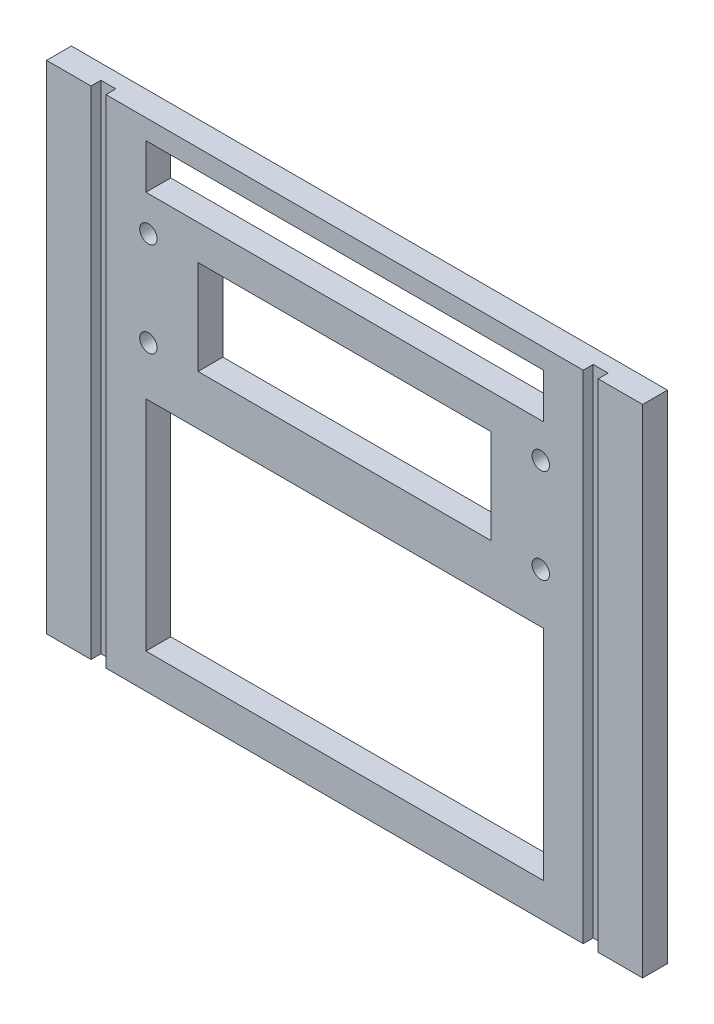
ISO-10303-21;
HEADER;
FILE_DESCRIPTION(('STEP AP214'),'2;1');
FILE_NAME('part.step','',(''),(''),'','','');
FILE_SCHEMA(('AUTOMOTIVE_DESIGN { 1 0 10303 214 1 1 1 1 }'));
ENDSEC;
DATA;
#1=APPLICATION_CONTEXT('core data for automotive mechanical design processes');
#2=APPLICATION_PROTOCOL_DEFINITION('international standard','automotive_design',2000,#1);
#3=PRODUCT_CONTEXT('',#1,'mechanical');
#4=PRODUCT('Part','Part','',(#3));
#5=PRODUCT_RELATED_PRODUCT_CATEGORY('part','',(#4));
#6=PRODUCT_DEFINITION_FORMATION('','',#4);
#7=PRODUCT_DEFINITION_CONTEXT('part definition',#1,'design');
#8=PRODUCT_DEFINITION('design','',#6,#7);
#9=PRODUCT_DEFINITION_SHAPE('','',#8);
#10=(LENGTH_UNIT() NAMED_UNIT(*) SI_UNIT(.MILLI.,.METRE.));
#11=(NAMED_UNIT(*) PLANE_ANGLE_UNIT() SI_UNIT($,.RADIAN.));
#12=(NAMED_UNIT(*) SI_UNIT($,.STERADIAN.) SOLID_ANGLE_UNIT());
#13=UNCERTAINTY_MEASURE_WITH_UNIT(LENGTH_MEASURE(1.E-05),#10,'distance_accuracy_value','');
#14=(GEOMETRIC_REPRESENTATION_CONTEXT(3) GLOBAL_UNCERTAINTY_ASSIGNED_CONTEXT((#13)) GLOBAL_UNIT_ASSIGNED_CONTEXT((#10,
#11,#12)) REPRESENTATION_CONTEXT('',''));
#15=CARTESIAN_POINT('',(0.,0.,0.));
#16=DIRECTION('',(0.,0.,1.));
#17=DIRECTION('',(1.,0.,0.));
#18=AXIS2_PLACEMENT_3D('',#15,#16,#17);
#19=CARTESIAN_POINT('',(0.,0.,5.));
#20=DIRECTION('',(0.,0.,-1.));
#21=DIRECTION('',(-1.,0.,0.));
#22=AXIS2_PLACEMENT_3D('',#19,#20,#21);
#23=PLANE('',#22);
#24=DIRECTION('',(1.,0.,0.));
#25=VECTOR('',#24,1.);
#26=CARTESIAN_POINT('',(0.,0.,5.));
#27=LINE('',#26,#25);
#28=CARTESIAN_POINT('',(0.,0.,5.));
#29=VERTEX_POINT('',#28);
#30=CARTESIAN_POINT('',(8.94999999999998,0.,5.));
#31=VERTEX_POINT('',#30);
#32=EDGE_CURVE('E381',#29,#31,#27,.T.);
#33=ORIENTED_EDGE('',*,*,#32,.T.);
#34=DIRECTION('',(0.,-1.,0.));
#35=VECTOR('',#34,1.);
#36=CARTESIAN_POINT('',(8.94999999999997,100.,5.));
#37=LINE('',#36,#35);
#38=CARTESIAN_POINT('',(8.94999999999997,100.,5.));
#39=VERTEX_POINT('',#38);
#40=EDGE_CURVE('E338',#39,#31,#37,.T.);
#41=ORIENTED_EDGE('',*,*,#40,.F.);
#42=DIRECTION('',(-1.,0.,0.));
#43=VECTOR('',#42,1.);
#44=CARTESIAN_POINT('',(0.,100.,5.));
#45=LINE('',#44,#43);
#46=CARTESIAN_POINT('',(0.,100.,5.));
#47=VERTEX_POINT('',#46);
#48=EDGE_CURVE('E387',#39,#47,#45,.T.);
#49=ORIENTED_EDGE('',*,*,#48,.T.);
#50=DIRECTION('',(0.,-1.,0.));
#51=VECTOR('',#50,1.);
#52=CARTESIAN_POINT('',(0.,0.,5.));
#53=LINE('',#52,#51);
#54=EDGE_CURVE('E376',#47,#29,#53,.T.);
#55=ORIENTED_EDGE('',*,*,#54,.T.);
#56=EDGE_LOOP('',(#33,#41,#49,#55));
#57=FACE_BOUND('',#56,.T.);
#58=ADVANCED_FACE('F37',(#57),#23,.F.);
#59=DIRECTION('',(1.,0.,0.));
#60=VECTOR('',#59,1.);
#61=CARTESIAN_POINT('',(20.,7.,5.));
#62=LINE('',#61,#60);
#63=CARTESIAN_POINT('',(20.,7.,5.));
#64=VERTEX_POINT('',#63);
#65=CARTESIAN_POINT('',(100.,7.,5.));
#66=VERTEX_POINT('',#65);
#67=EDGE_CURVE('E292',#64,#66,#62,.T.);
#68=ORIENTED_EDGE('',*,*,#67,.F.);
#69=DIRECTION('',(0.,-1.,0.));
#70=VECTOR('',#69,1.);
#71=CARTESIAN_POINT('',(20.,51.,5.));
#72=LINE('',#71,#70);
#73=CARTESIAN_POINT('',(20.,51.,5.));
#74=VERTEX_POINT('',#73);
#75=EDGE_CURVE('E52',#74,#64,#72,.T.);
#76=ORIENTED_EDGE('',*,*,#75,.F.);
#77=DIRECTION('',(-1.,0.,0.));
#78=VECTOR('',#77,1.);
#79=CARTESIAN_POINT('',(20.,51.,5.));
#80=LINE('',#79,#78);
#81=CARTESIAN_POINT('',(100.,51.,5.));
#82=VERTEX_POINT('',#81);
#83=EDGE_CURVE('E281',#82,#74,#80,.T.);
#84=ORIENTED_EDGE('',*,*,#83,.F.);
#85=DIRECTION('',(0.,1.,0.));
#86=VECTOR('',#85,1.);
#87=CARTESIAN_POINT('',(100.,51.,5.));
#88=LINE('',#87,#86);
#89=EDGE_CURVE('E295',#66,#82,#88,.T.);
#90=ORIENTED_EDGE('',*,*,#89,.F.);
#91=EDGE_LOOP('',(#68,#76,#84,#90));
#92=FACE_BOUND('',#91,.T.);
#93=CARTESIAN_POINT('',(99.5,61.,5.));
#94=DIRECTION('',(0.,0.,1.));
#95=DIRECTION('',(1.,0.,0.));
#96=AXIS2_PLACEMENT_3D('',#93,#94,#95);
#97=CIRCLE('',#96,1.75);
#98=CARTESIAN_POINT('',(101.25,61.,5.));
#99=VERTEX_POINT('',#98);
#100=EDGE_CURVE('E273',#99,#99,#97,.T.);
#101=ORIENTED_EDGE('',*,*,#100,.F.);
#102=EDGE_LOOP('',(#101));
#103=FACE_BOUND('',#102,.T.);
#104=CARTESIAN_POINT('',(99.5,80.,5.));
#105=DIRECTION('',(0.,0.,1.));
#106=DIRECTION('',(1.,0.,0.));
#107=AXIS2_PLACEMENT_3D('',#104,#105,#106);
#108=CIRCLE('',#107,1.75);
#109=CARTESIAN_POINT('',(101.25,80.,5.));
#110=VERTEX_POINT('',#109);
#111=EDGE_CURVE('E272',#110,#110,#108,.T.);
#112=ORIENTED_EDGE('',*,*,#111,.F.);
#113=EDGE_LOOP('',(#112));
#114=FACE_BOUND('',#113,.T.);
#115=CARTESIAN_POINT('',(20.5,61.,5.));
#116=DIRECTION('',(0.,0.,1.));
#117=DIRECTION('',(1.,0.,0.));
#118=AXIS2_PLACEMENT_3D('',#115,#116,#117);
#119=CIRCLE('',#118,1.75);
#120=CARTESIAN_POINT('',(22.25,61.,5.));
#121=VERTEX_POINT('',#120);
#122=EDGE_CURVE('E310',#121,#121,#119,.T.);
#123=ORIENTED_EDGE('',*,*,#122,.F.);
#124=EDGE_LOOP('',(#123));
#125=FACE_BOUND('',#124,.T.);
#126=DIRECTION('',(1.,0.,0.));
#127=VECTOR('',#126,1.);
#128=CARTESIAN_POINT('',(20.,87.,5.));
#129=LINE('',#128,#127);
#130=CARTESIAN_POINT('',(20.,87.,5.));
#131=VERTEX_POINT('',#130);
#132=CARTESIAN_POINT('',(100.,87.,5.));
#133=VERTEX_POINT('',#132);
#134=EDGE_CURVE('E228',#131,#133,#129,.T.);
#135=ORIENTED_EDGE('',*,*,#134,.F.);
#136=DIRECTION('',(0.,-1.,0.));
#137=VECTOR('',#136,1.);
#138=CARTESIAN_POINT('',(20.,87.,5.));
#139=LINE('',#138,#137);
#140=CARTESIAN_POINT('',(20.,96.,5.));
#141=VERTEX_POINT('',#140);
#142=EDGE_CURVE('E60',#141,#131,#139,.T.);
#143=ORIENTED_EDGE('',*,*,#142,.F.);
#144=DIRECTION('',(-1.,0.,0.));
#145=VECTOR('',#144,1.);
#146=CARTESIAN_POINT('',(20.,96.,5.));
#147=LINE('',#146,#145);
#148=CARTESIAN_POINT('',(100.,96.,5.));
#149=VERTEX_POINT('',#148);
#150=EDGE_CURVE('E219',#149,#141,#147,.T.);
#151=ORIENTED_EDGE('',*,*,#150,.F.);
#152=DIRECTION('',(0.,1.,0.));
#153=VECTOR('',#152,1.);
#154=CARTESIAN_POINT('',(100.,87.,5.));
#155=LINE('',#154,#153);
#156=EDGE_CURVE('E222',#133,#149,#155,.T.);
#157=ORIENTED_EDGE('',*,*,#156,.F.);
#158=EDGE_LOOP('',(#135,#143,#151,#157));
#159=FACE_BOUND('',#158,.T.);
#160=DIRECTION('',(1.,0.,0.));
#161=VECTOR('',#160,1.);
#162=CARTESIAN_POINT('',(30.5,61.,5.));
#163=LINE('',#162,#161);
#164=CARTESIAN_POINT('',(30.5,61.,5.));
#165=VERTEX_POINT('',#164);
#166=CARTESIAN_POINT('',(89.5,61.,5.));
#167=VERTEX_POINT('',#166);
#168=EDGE_CURVE('E254',#165,#167,#163,.T.);
#169=ORIENTED_EDGE('',*,*,#168,.F.);
#170=DIRECTION('',(0.,-1.,0.));
#171=VECTOR('',#170,1.);
#172=CARTESIAN_POINT('',(30.5,80.,5.));
#173=LINE('',#172,#171);
#174=CARTESIAN_POINT('',(30.5,80.,5.));
#175=VERTEX_POINT('',#174);
#176=EDGE_CURVE('E252',#175,#165,#173,.T.);
#177=ORIENTED_EDGE('',*,*,#176,.F.);
#178=DIRECTION('',(-1.,0.,0.));
#179=VECTOR('',#178,1.);
#180=CARTESIAN_POINT('',(30.5,80.,5.));
#181=LINE('',#180,#179);
#182=CARTESIAN_POINT('',(89.5,80.,5.));
#183=VERTEX_POINT('',#182);
#184=EDGE_CURVE('E242',#183,#175,#181,.T.);
#185=ORIENTED_EDGE('',*,*,#184,.F.);
#186=DIRECTION('',(0.,1.,0.));
#187=VECTOR('',#186,1.);
#188=CARTESIAN_POINT('',(89.5,80.,5.));
#189=LINE('',#188,#187);
#190=EDGE_CURVE('E257',#167,#183,#189,.T.);
#191=ORIENTED_EDGE('',*,*,#190,.F.);
#192=EDGE_LOOP('',(#169,#177,#185,#191));
#193=FACE_BOUND('',#192,.T.);
#194=CARTESIAN_POINT('',(20.5,80.,5.));
#195=DIRECTION('',(0.,0.,1.));
#196=DIRECTION('',(1.,0.,0.));
#197=AXIS2_PLACEMENT_3D('',#194,#195,#196);
#198=CIRCLE('',#197,1.75);
#199=CARTESIAN_POINT('',(22.25,80.,5.));
#200=VERTEX_POINT('',#199);
#201=EDGE_CURVE('E309',#200,#200,#198,.T.);
#202=ORIENTED_EDGE('',*,*,#201,.F.);
#203=EDGE_LOOP('',(#202));
#204=FACE_BOUND('',#203,.T.);
#205=CARTESIAN_POINT('',(108.05,100.,5.));
#206=VERTEX_POINT('',#205);
#207=CARTESIAN_POINT('',(11.95,100.,5.));
#208=VERTEX_POINT('',#207);
#209=EDGE_CURVE('E392',#206,#208,#45,.T.);
#210=ORIENTED_EDGE('',*,*,#209,.T.);
#211=DIRECTION('',(0.,1.,0.));
#212=VECTOR('',#211,1.);
#213=CARTESIAN_POINT('',(11.95,100.,5.));
#214=LINE('',#213,#212);
#215=CARTESIAN_POINT('',(11.95,0.,5.));
#216=VERTEX_POINT('',#215);
#217=EDGE_CURVE('E328',#216,#208,#214,.T.);
#218=ORIENTED_EDGE('',*,*,#217,.F.);
#219=CARTESIAN_POINT('',(108.05,0.,5.));
#220=VERTEX_POINT('',#219);
#221=EDGE_CURVE('E385',#216,#220,#27,.T.);
#222=ORIENTED_EDGE('',*,*,#221,.T.);
#223=DIRECTION('',(0.,-1.,0.));
#224=VECTOR('',#223,1.);
#225=CARTESIAN_POINT('',(108.05,0.,5.));
#226=LINE('',#225,#224);
#227=EDGE_CURVE('E321',#206,#220,#226,.T.);
#228=ORIENTED_EDGE('',*,*,#227,.F.);
#229=EDGE_LOOP('',(#210,#218,#222,#228));
#230=FACE_BOUND('',#229,.T.);
#231=ADVANCED_FACE('F432',(#92,#103,#114,#125,#159,#193,#204,#230),#23,.F.);
#232=CARTESIAN_POINT('',(0.,0.,5.));
#233=DIRECTION('',(1.,0.,0.));
#234=DIRECTION('',(0.,1.,0.));
#235=AXIS2_PLACEMENT_3D('',#232,#233,#234);
#236=PLANE('',#235);
#237=DIRECTION('',(0.,-1.,0.));
#238=VECTOR('',#237,1.);
#239=CARTESIAN_POINT('',(0.,0.,0.));
#240=LINE('',#239,#238);
#241=CARTESIAN_POINT('',(0.,100.,0.));
#242=VERTEX_POINT('',#241);
#243=CARTESIAN_POINT('',(0.,0.,0.));
#244=VERTEX_POINT('',#243);
#245=EDGE_CURVE('E344',#242,#244,#240,.T.);
#246=ORIENTED_EDGE('',*,*,#245,.T.);
#247=DIRECTION('',(0.,0.,-1.));
#248=VECTOR('',#247,1.);
#249=CARTESIAN_POINT('',(0.,0.,5.));
#250=LINE('',#249,#248);
#251=EDGE_CURVE('E11',#29,#244,#250,.T.);
#252=ORIENTED_EDGE('',*,*,#251,.F.);
#253=ORIENTED_EDGE('',*,*,#54,.F.);
#254=DIRECTION('',(0.,0.,-1.));
#255=VECTOR('',#254,1.);
#256=CARTESIAN_POINT('',(0.,100.,5.));
#257=LINE('',#256,#255);
#258=EDGE_CURVE('E391',#47,#242,#257,.T.);
#259=ORIENTED_EDGE('',*,*,#258,.T.);
#260=EDGE_LOOP('',(#246,#252,#253,#259));
#261=FACE_BOUND('',#260,.T.);
#262=ADVANCED_FACE('F39',(#261),#236,.F.);
#263=CARTESIAN_POINT('',(0.,0.,5.));
#264=DIRECTION('',(0.,1.,0.));
#265=DIRECTION('',(0.,0.,1.));
#266=AXIS2_PLACEMENT_3D('',#263,#264,#265);
#267=PLANE('',#266);
#268=DIRECTION('',(1.,0.,0.));
#269=VECTOR('',#268,1.);
#270=CARTESIAN_POINT('',(8.94999999999998,0.,3.));
#271=LINE('',#270,#269);
#272=CARTESIAN_POINT('',(8.94999999999998,0.,3.));
#273=VERTEX_POINT('',#272);
#274=CARTESIAN_POINT('',(11.95,0.,3.));
#275=VERTEX_POINT('',#274);
#276=EDGE_CURVE('E327',#273,#275,#271,.T.);
#277=ORIENTED_EDGE('',*,*,#276,.F.);
#278=DIRECTION('',(0.,0.,1.));
#279=VECTOR('',#278,1.);
#280=CARTESIAN_POINT('',(8.94999999999998,0.,3.));
#281=LINE('',#280,#279);
#282=EDGE_CURVE('E337',#273,#31,#281,.T.);
#283=ORIENTED_EDGE('',*,*,#282,.T.);
#284=ORIENTED_EDGE('',*,*,#32,.F.);
#285=ORIENTED_EDGE('',*,*,#251,.T.);
#286=DIRECTION('',(1.,0.,0.));
#287=VECTOR('',#286,1.);
#288=CARTESIAN_POINT('',(0.,0.,0.));
#289=LINE('',#288,#287);
#290=CARTESIAN_POINT('',(120.,0.,0.));
#291=VERTEX_POINT('',#290);
#292=EDGE_CURVE('E395',#244,#291,#289,.T.);
#293=ORIENTED_EDGE('',*,*,#292,.T.);
#294=DIRECTION('',(0.,0.,-1.));
#295=VECTOR('',#294,1.);
#296=CARTESIAN_POINT('',(120.,0.,5.));
#297=LINE('',#296,#295);
#298=CARTESIAN_POINT('',(120.,0.,5.));
#299=VERTEX_POINT('',#298);
#300=EDGE_CURVE('E45',#299,#291,#297,.T.);
#301=ORIENTED_EDGE('',*,*,#300,.F.);
#302=CARTESIAN_POINT('',(111.05,0.,5.));
#303=VERTEX_POINT('',#302);
#304=EDGE_CURVE('E379',#303,#299,#27,.T.);
#305=ORIENTED_EDGE('',*,*,#304,.F.);
#306=DIRECTION('',(0.,0.,1.));
#307=VECTOR('',#306,1.);
#308=CARTESIAN_POINT('',(111.05,0.,3.));
#309=LINE('',#308,#307);
#310=CARTESIAN_POINT('',(111.05,0.,3.));
#311=VERTEX_POINT('',#310);
#312=EDGE_CURVE('E372',#311,#303,#309,.T.);
#313=ORIENTED_EDGE('',*,*,#312,.F.);
#314=DIRECTION('',(1.,0.,0.));
#315=VECTOR('',#314,1.);
#316=CARTESIAN_POINT('',(108.05,0.,3.));
#317=LINE('',#316,#315);
#318=CARTESIAN_POINT('',(108.05,0.,3.));
#319=VERTEX_POINT('',#318);
#320=EDGE_CURVE('E355',#319,#311,#317,.T.);
#321=ORIENTED_EDGE('',*,*,#320,.F.);
#322=DIRECTION('',(0.,0.,1.));
#323=VECTOR('',#322,1.);
#324=CARTESIAN_POINT('',(108.05,0.,3.));
#325=LINE('',#324,#323);
#326=EDGE_CURVE('E365',#319,#220,#325,.T.);
#327=ORIENTED_EDGE('',*,*,#326,.T.);
#328=ORIENTED_EDGE('',*,*,#221,.F.);
#329=DIRECTION('',(0.,0.,1.));
#330=VECTOR('',#329,1.);
#331=CARTESIAN_POINT('',(11.95,0.,3.));
#332=LINE('',#331,#330);
#333=EDGE_CURVE('E348',#275,#216,#332,.T.);
#334=ORIENTED_EDGE('',*,*,#333,.F.);
#335=EDGE_LOOP('',(#277,#283,#284,#285,#293,#301,#305,#313,#321,#327,#328,#334));
#336=FACE_BOUND('',#335,.T.);
#337=ADVANCED_FACE('F444',(#336),#267,.F.);
#338=CARTESIAN_POINT('',(120.,0.,5.));
#339=DIRECTION('',(-1.,0.,0.));
#340=DIRECTION('',(0.,-1.,0.));
#341=AXIS2_PLACEMENT_3D('',#338,#339,#340);
#342=PLANE('',#341);
#343=DIRECTION('',(0.,1.,0.));
#344=VECTOR('',#343,1.);
#345=CARTESIAN_POINT('',(120.,0.,0.));
#346=LINE('',#345,#344);
#347=CARTESIAN_POINT('',(120.,100.,0.));
#348=VERTEX_POINT('',#347);
#349=EDGE_CURVE('E397',#291,#348,#346,.T.);
#350=ORIENTED_EDGE('',*,*,#349,.T.);
#351=DIRECTION('',(0.,0.,-1.));
#352=VECTOR('',#351,1.);
#353=CARTESIAN_POINT('',(120.,100.,5.));
#354=LINE('',#353,#352);
#355=CARTESIAN_POINT('',(120.,100.,5.));
#356=VERTEX_POINT('',#355);
#357=EDGE_CURVE('E402',#356,#348,#354,.T.);
#358=ORIENTED_EDGE('',*,*,#357,.F.);
#359=DIRECTION('',(0.,1.,0.));
#360=VECTOR('',#359,1.);
#361=CARTESIAN_POINT('',(120.,0.,5.));
#362=LINE('',#361,#360);
#363=EDGE_CURVE('E384',#299,#356,#362,.T.);
#364=ORIENTED_EDGE('',*,*,#363,.F.);
#365=ORIENTED_EDGE('',*,*,#300,.T.);
#366=EDGE_LOOP('',(#350,#358,#364,#365));
#367=FACE_BOUND('',#366,.T.);
#368=ADVANCED_FACE('F409',(#367),#342,.F.);
#369=CARTESIAN_POINT('',(0.,100.,5.));
#370=DIRECTION('',(0.,-1.,0.));
#371=DIRECTION('',(0.,0.,-1.));
#372=AXIS2_PLACEMENT_3D('',#369,#370,#371);
#373=PLANE('',#372);
#374=ORIENTED_EDGE('',*,*,#48,.F.);
#375=DIRECTION('',(0.,0.,1.));
#376=VECTOR('',#375,1.);
#377=CARTESIAN_POINT('',(8.94999999999997,100.,3.));
#378=LINE('',#377,#376);
#379=CARTESIAN_POINT('',(8.94999999999997,100.,3.));
#380=VERTEX_POINT('',#379);
#381=EDGE_CURVE('E342',#380,#39,#378,.T.);
#382=ORIENTED_EDGE('',*,*,#381,.F.);
#383=DIRECTION('',(-1.,0.,0.));
#384=VECTOR('',#383,1.);
#385=CARTESIAN_POINT('',(8.94999999999997,100.,3.));
#386=LINE('',#385,#384);
#387=CARTESIAN_POINT('',(11.95,100.,3.));
#388=VERTEX_POINT('',#387);
#389=EDGE_CURVE('E334',#388,#380,#386,.T.);
#390=ORIENTED_EDGE('',*,*,#389,.F.);
#391=DIRECTION('',(0.,0.,1.));
#392=VECTOR('',#391,1.);
#393=CARTESIAN_POINT('',(11.95,100.,3.));
#394=LINE('',#393,#392);
#395=EDGE_CURVE('E345',#388,#208,#394,.T.);
#396=ORIENTED_EDGE('',*,*,#395,.T.);
#397=ORIENTED_EDGE('',*,*,#209,.F.);
#398=DIRECTION('',(0.,0.,1.));
#399=VECTOR('',#398,1.);
#400=CARTESIAN_POINT('',(108.05,100.,3.));
#401=LINE('',#400,#399);
#402=CARTESIAN_POINT('',(108.05,100.,3.));
#403=VERTEX_POINT('',#402);
#404=EDGE_CURVE('E340',#403,#206,#401,.T.);
#405=ORIENTED_EDGE('',*,*,#404,.F.);
#406=DIRECTION('',(-1.,0.,0.));
#407=VECTOR('',#406,1.);
#408=CARTESIAN_POINT('',(108.05,100.,3.));
#409=LINE('',#408,#407);
#410=CARTESIAN_POINT('',(111.05,100.,3.));
#411=VERTEX_POINT('',#410);
#412=EDGE_CURVE('E362',#411,#403,#409,.T.);
#413=ORIENTED_EDGE('',*,*,#412,.F.);
#414=DIRECTION('',(0.,0.,1.));
#415=VECTOR('',#414,1.);
#416=CARTESIAN_POINT('',(111.05,100.,3.));
#417=LINE('',#416,#415);
#418=CARTESIAN_POINT('',(111.05,100.,5.));
#419=VERTEX_POINT('',#418);
#420=EDGE_CURVE('E369',#411,#419,#417,.T.);
#421=ORIENTED_EDGE('',*,*,#420,.T.);
#422=EDGE_CURVE('E388',#356,#419,#45,.T.);
#423=ORIENTED_EDGE('',*,*,#422,.F.);
#424=ORIENTED_EDGE('',*,*,#357,.T.);
#425=DIRECTION('',(-1.,0.,0.));
#426=VECTOR('',#425,1.);
#427=CARTESIAN_POINT('',(0.,100.,0.));
#428=LINE('',#427,#426);
#429=EDGE_CURVE('E380',#348,#242,#428,.T.);
#430=ORIENTED_EDGE('',*,*,#429,.T.);
#431=ORIENTED_EDGE('',*,*,#258,.F.);
#432=EDGE_LOOP('',(#374,#382,#390,#396,#397,#405,#413,#421,#423,#424,#430,#431));
#433=FACE_BOUND('',#432,.T.);
#434=ADVANCED_FACE('F419',(#433),#373,.F.);
#435=ORIENTED_EDGE('',*,*,#422,.T.);
#436=DIRECTION('',(0.,1.,0.));
#437=VECTOR('',#436,1.);
#438=CARTESIAN_POINT('',(111.05,0.,5.));
#439=LINE('',#438,#437);
#440=EDGE_CURVE('E356',#303,#419,#439,.T.);
#441=ORIENTED_EDGE('',*,*,#440,.F.);
#442=ORIENTED_EDGE('',*,*,#304,.T.);
#443=ORIENTED_EDGE('',*,*,#363,.T.);
#444=EDGE_LOOP('',(#435,#441,#442,#443));
#445=FACE_BOUND('',#444,.T.);
#446=ADVANCED_FACE('F448',(#445),#23,.F.);
#447=CARTESIAN_POINT('',(0.,0.,0.));
#448=DIRECTION('',(0.,0.,-1.));
#449=DIRECTION('',(-1.,0.,0.));
#450=AXIS2_PLACEMENT_3D('',#447,#448,#449);
#451=PLANE('',#450);
#452=DIRECTION('',(0.,-1.,0.));
#453=VECTOR('',#452,1.);
#454=CARTESIAN_POINT('',(20.,51.,0.));
#455=LINE('',#454,#453);
#456=CARTESIAN_POINT('',(20.,51.,0.));
#457=VERTEX_POINT('',#456);
#458=CARTESIAN_POINT('',(20.,7.,0.));
#459=VERTEX_POINT('',#458);
#460=EDGE_CURVE('E277',#457,#459,#455,.T.);
#461=ORIENTED_EDGE('',*,*,#460,.T.);
#462=DIRECTION('',(1.,0.,0.));
#463=VECTOR('',#462,1.);
#464=CARTESIAN_POINT('',(20.,7.,0.));
#465=LINE('',#464,#463);
#466=CARTESIAN_POINT('',(100.,7.,0.));
#467=VERTEX_POINT('',#466);
#468=EDGE_CURVE('E280',#459,#467,#465,.T.);
#469=ORIENTED_EDGE('',*,*,#468,.T.);
#470=DIRECTION('',(0.,1.,0.));
#471=VECTOR('',#470,1.);
#472=CARTESIAN_POINT('',(100.,51.,0.));
#473=LINE('',#472,#471);
#474=CARTESIAN_POINT('',(100.,51.,0.));
#475=VERTEX_POINT('',#474);
#476=EDGE_CURVE('E284',#467,#475,#473,.T.);
#477=ORIENTED_EDGE('',*,*,#476,.T.);
#478=DIRECTION('',(-1.,0.,0.));
#479=VECTOR('',#478,1.);
#480=CARTESIAN_POINT('',(20.,51.,0.));
#481=LINE('',#480,#479);
#482=EDGE_CURVE('E287',#475,#457,#481,.T.);
#483=ORIENTED_EDGE('',*,*,#482,.T.);
#484=EDGE_LOOP('',(#461,#469,#477,#483));
#485=FACE_BOUND('',#484,.T.);
#486=CARTESIAN_POINT('',(99.5,61.,0.));
#487=DIRECTION('',(0.,0.,1.));
#488=DIRECTION('',(1.,0.,0.));
#489=AXIS2_PLACEMENT_3D('',#486,#487,#488);
#490=CIRCLE('',#489,1.75);
#491=CARTESIAN_POINT('',(101.25,61.,0.));
#492=VERTEX_POINT('',#491);
#493=EDGE_CURVE('E269',#492,#492,#490,.T.);
#494=ORIENTED_EDGE('',*,*,#493,.T.);
#495=EDGE_LOOP('',(#494));
#496=FACE_BOUND('',#495,.T.);
#497=CARTESIAN_POINT('',(99.5,80.,0.));
#498=DIRECTION('',(0.,0.,1.));
#499=DIRECTION('',(1.,0.,0.));
#500=AXIS2_PLACEMENT_3D('',#497,#498,#499);
#501=CIRCLE('',#500,1.75);
#502=CARTESIAN_POINT('',(101.25,80.,0.));
#503=VERTEX_POINT('',#502);
#504=EDGE_CURVE('E313',#503,#503,#501,.T.);
#505=ORIENTED_EDGE('',*,*,#504,.T.);
#506=EDGE_LOOP('',(#505));
#507=FACE_BOUND('',#506,.T.);
#508=CARTESIAN_POINT('',(20.5,61.,0.));
#509=DIRECTION('',(0.,0.,1.));
#510=DIRECTION('',(1.,0.,0.));
#511=AXIS2_PLACEMENT_3D('',#508,#509,#510);
#512=CIRCLE('',#511,1.75);
#513=CARTESIAN_POINT('',(22.25,61.,0.));
#514=VERTEX_POINT('',#513);
#515=EDGE_CURVE('E306',#514,#514,#512,.T.);
#516=ORIENTED_EDGE('',*,*,#515,.T.);
#517=EDGE_LOOP('',(#516));
#518=FACE_BOUND('',#517,.T.);
#519=DIRECTION('',(0.,-1.,0.));
#520=VECTOR('',#519,1.);
#521=CARTESIAN_POINT('',(20.,87.,0.));
#522=LINE('',#521,#520);
#523=CARTESIAN_POINT('',(20.,96.,0.));
#524=VERTEX_POINT('',#523);
#525=CARTESIAN_POINT('',(20.,87.,0.));
#526=VERTEX_POINT('',#525);
#527=EDGE_CURVE('E200',#524,#526,#522,.T.);
#528=ORIENTED_EDGE('',*,*,#527,.T.);
#529=DIRECTION('',(1.,0.,0.));
#530=VECTOR('',#529,1.);
#531=CARTESIAN_POINT('',(20.,87.,0.));
#532=LINE('',#531,#530);
#533=CARTESIAN_POINT('',(100.,87.,0.));
#534=VERTEX_POINT('',#533);
#535=EDGE_CURVE('E210',#526,#534,#532,.T.);
#536=ORIENTED_EDGE('',*,*,#535,.T.);
#537=DIRECTION('',(0.,1.,0.));
#538=VECTOR('',#537,1.);
#539=CARTESIAN_POINT('',(100.,87.,0.));
#540=LINE('',#539,#538);
#541=CARTESIAN_POINT('',(100.,96.,0.));
#542=VERTEX_POINT('',#541);
#543=EDGE_CURVE('E214',#534,#542,#540,.T.);
#544=ORIENTED_EDGE('',*,*,#543,.T.);
#545=DIRECTION('',(-1.,0.,0.));
#546=VECTOR('',#545,1.);
#547=CARTESIAN_POINT('',(20.,96.,0.));
#548=LINE('',#547,#546);
#549=EDGE_CURVE('E206',#542,#524,#548,.T.);
#550=ORIENTED_EDGE('',*,*,#549,.T.);
#551=EDGE_LOOP('',(#528,#536,#544,#550));
#552=FACE_BOUND('',#551,.T.);
#553=DIRECTION('',(0.,-1.,0.));
#554=VECTOR('',#553,1.);
#555=CARTESIAN_POINT('',(30.5,80.,0.));
#556=LINE('',#555,#554);
#557=CARTESIAN_POINT('',(30.5,80.,0.));
#558=VERTEX_POINT('',#557);
#559=CARTESIAN_POINT('',(30.5,61.,0.));
#560=VERTEX_POINT('',#559);
#561=EDGE_CURVE('E238',#558,#560,#556,.T.);
#562=ORIENTED_EDGE('',*,*,#561,.T.);
#563=DIRECTION('',(1.,0.,0.));
#564=VECTOR('',#563,1.);
#565=CARTESIAN_POINT('',(30.5,61.,0.));
#566=LINE('',#565,#564);
#567=CARTESIAN_POINT('',(89.5,61.,0.));
#568=VERTEX_POINT('',#567);
#569=EDGE_CURVE('E241',#560,#568,#566,.T.);
#570=ORIENTED_EDGE('',*,*,#569,.T.);
#571=DIRECTION('',(0.,1.,0.));
#572=VECTOR('',#571,1.);
#573=CARTESIAN_POINT('',(89.5,80.,0.));
#574=LINE('',#573,#572);
#575=CARTESIAN_POINT('',(89.5,80.,0.));
#576=VERTEX_POINT('',#575);
#577=EDGE_CURVE('E245',#568,#576,#574,.T.);
#578=ORIENTED_EDGE('',*,*,#577,.T.);
#579=DIRECTION('',(-1.,0.,0.));
#580=VECTOR('',#579,1.);
#581=CARTESIAN_POINT('',(30.5,80.,0.));
#582=LINE('',#581,#580);
#583=EDGE_CURVE('E248',#576,#558,#582,.T.);
#584=ORIENTED_EDGE('',*,*,#583,.T.);
#585=EDGE_LOOP('',(#562,#570,#578,#584));
#586=FACE_BOUND('',#585,.T.);
#587=CARTESIAN_POINT('',(20.5,80.,0.));
#588=DIRECTION('',(0.,0.,1.));
#589=DIRECTION('',(1.,0.,0.));
#590=AXIS2_PLACEMENT_3D('',#587,#588,#589);
#591=CIRCLE('',#590,1.75);
#592=CARTESIAN_POINT('',(22.25,80.,0.));
#593=VERTEX_POINT('',#592);
#594=EDGE_CURVE('E318',#593,#593,#591,.T.);
#595=ORIENTED_EDGE('',*,*,#594,.T.);
#596=EDGE_LOOP('',(#595));
#597=FACE_BOUND('',#596,.T.);
#598=ORIENTED_EDGE('',*,*,#245,.F.);
#599=ORIENTED_EDGE('',*,*,#429,.F.);
#600=ORIENTED_EDGE('',*,*,#349,.F.);
#601=ORIENTED_EDGE('',*,*,#292,.F.);
#602=EDGE_LOOP('',(#598,#599,#600,#601));
#603=FACE_BOUND('',#602,.T.);
#604=ADVANCED_FACE('F216',(#485,#496,#507,#518,#552,#586,#597,#603),#451,.T.);
#605=CARTESIAN_POINT('',(108.05,0.,3.));
#606=DIRECTION('',(-1.,0.,0.));
#607=DIRECTION('',(0.,0.,1.));
#608=AXIS2_PLACEMENT_3D('',#605,#606,#607);
#609=PLANE('',#608);
#610=ORIENTED_EDGE('',*,*,#227,.T.);
#611=ORIENTED_EDGE('',*,*,#326,.F.);
#612=DIRECTION('',(0.,-1.,0.));
#613=VECTOR('',#612,1.);
#614=CARTESIAN_POINT('',(108.05,0.,3.));
#615=LINE('',#614,#613);
#616=EDGE_CURVE('E352',#403,#319,#615,.T.);
#617=ORIENTED_EDGE('',*,*,#616,.F.);
#618=ORIENTED_EDGE('',*,*,#404,.T.);
#619=EDGE_LOOP('',(#610,#611,#617,#618));
#620=FACE_BOUND('',#619,.T.);
#621=ADVANCED_FACE('F455',(#620),#609,.F.);
#622=CARTESIAN_POINT('',(111.05,0.,3.));
#623=DIRECTION('',(1.,0.,0.));
#624=DIRECTION('',(0.,0.,-1.));
#625=AXIS2_PLACEMENT_3D('',#622,#623,#624);
#626=PLANE('',#625);
#627=ORIENTED_EDGE('',*,*,#440,.T.);
#628=ORIENTED_EDGE('',*,*,#420,.F.);
#629=DIRECTION('',(0.,1.,0.));
#630=VECTOR('',#629,1.);
#631=CARTESIAN_POINT('',(111.05,0.,3.));
#632=LINE('',#631,#630);
#633=EDGE_CURVE('E359',#311,#411,#632,.T.);
#634=ORIENTED_EDGE('',*,*,#633,.F.);
#635=ORIENTED_EDGE('',*,*,#312,.T.);
#636=EDGE_LOOP('',(#627,#628,#634,#635));
#637=FACE_BOUND('',#636,.T.);
#638=ADVANCED_FACE('F451',(#637),#626,.F.);
#639=CARTESIAN_POINT('',(0.,0.,3.));
#640=DIRECTION('',(0.,0.,-1.));
#641=DIRECTION('',(-1.,0.,0.));
#642=AXIS2_PLACEMENT_3D('',#639,#640,#641);
#643=PLANE('',#642);
#644=ORIENTED_EDGE('',*,*,#616,.T.);
#645=ORIENTED_EDGE('',*,*,#320,.T.);
#646=ORIENTED_EDGE('',*,*,#633,.T.);
#647=ORIENTED_EDGE('',*,*,#412,.T.);
#648=EDGE_LOOP('',(#644,#645,#646,#647));
#649=FACE_BOUND('',#648,.T.);
#650=ADVANCED_FACE('F453',(#649),#643,.F.);
#651=CARTESIAN_POINT('',(8.94999999999997,100.,3.));
#652=DIRECTION('',(-1.,0.,0.));
#653=DIRECTION('',(0.,-1.,0.));
#654=AXIS2_PLACEMENT_3D('',#651,#652,#653);
#655=PLANE('',#654);
#656=ORIENTED_EDGE('',*,*,#40,.T.);
#657=ORIENTED_EDGE('',*,*,#282,.F.);
#658=DIRECTION('',(0.,-1.,0.));
#659=VECTOR('',#658,1.);
#660=CARTESIAN_POINT('',(8.94999999999997,100.,3.));
#661=LINE('',#660,#659);
#662=EDGE_CURVE('E324',#380,#273,#661,.T.);
#663=ORIENTED_EDGE('',*,*,#662,.F.);
#664=ORIENTED_EDGE('',*,*,#381,.T.);
#665=EDGE_LOOP('',(#656,#657,#663,#664));
#666=FACE_BOUND('',#665,.T.);
#667=ADVANCED_FACE('F667',(#666),#655,.F.);
#668=CARTESIAN_POINT('',(11.95,100.,3.));
#669=DIRECTION('',(1.,0.,0.));
#670=DIRECTION('',(0.,1.,0.));
#671=AXIS2_PLACEMENT_3D('',#668,#669,#670);
#672=PLANE('',#671);
#673=ORIENTED_EDGE('',*,*,#217,.T.);
#674=ORIENTED_EDGE('',*,*,#395,.F.);
#675=DIRECTION('',(0.,1.,0.));
#676=VECTOR('',#675,1.);
#677=CARTESIAN_POINT('',(11.95,100.,3.));
#678=LINE('',#677,#676);
#679=EDGE_CURVE('E331',#275,#388,#678,.T.);
#680=ORIENTED_EDGE('',*,*,#679,.F.);
#681=ORIENTED_EDGE('',*,*,#333,.T.);
#682=EDGE_LOOP('',(#673,#674,#680,#681));
#683=FACE_BOUND('',#682,.T.);
#684=ADVANCED_FACE('F439',(#683),#672,.F.);
#685=CARTESIAN_POINT('',(0.,0.,3.));
#686=DIRECTION('',(0.,0.,1.));
#687=DIRECTION('',(1.,0.,0.));
#688=AXIS2_PLACEMENT_3D('',#685,#686,#687);
#689=PLANE('',#688);
#690=ORIENTED_EDGE('',*,*,#662,.T.);
#691=ORIENTED_EDGE('',*,*,#276,.T.);
#692=ORIENTED_EDGE('',*,*,#679,.T.);
#693=ORIENTED_EDGE('',*,*,#389,.T.);
#694=EDGE_LOOP('',(#690,#691,#692,#693));
#695=FACE_BOUND('',#694,.T.);
#696=ADVANCED_FACE('F441',(#695),#689,.T.);
#697=CARTESIAN_POINT('',(20.5,80.,0.));
#698=DIRECTION('',(0.,0.,1.));
#699=DIRECTION('',(1.,0.,0.));
#700=AXIS2_PLACEMENT_3D('',#697,#698,#699);
#701=CYLINDRICAL_SURFACE('',#700,1.75);
#702=ORIENTED_EDGE('',*,*,#594,.F.);
#703=EDGE_LOOP('',(#702));
#704=FACE_BOUND('',#703,.T.);
#705=ORIENTED_EDGE('',*,*,#201,.T.);
#706=EDGE_LOOP('',(#705));
#707=FACE_BOUND('',#706,.T.);
#708=ADVANCED_FACE('F509',(#704,#707),#701,.F.);
#709=CARTESIAN_POINT('',(30.5,80.,0.));
#710=DIRECTION('',(-1.,0.,0.));
#711=DIRECTION('',(0.,-1.,0.));
#712=AXIS2_PLACEMENT_3D('',#709,#710,#711);
#713=PLANE('',#712);
#714=ORIENTED_EDGE('',*,*,#176,.T.);
#715=DIRECTION('',(0.,0.,1.));
#716=VECTOR('',#715,1.);
#717=CARTESIAN_POINT('',(30.5,61.,0.));
#718=LINE('',#717,#716);
#719=EDGE_CURVE('E251',#560,#165,#718,.T.);
#720=ORIENTED_EDGE('',*,*,#719,.F.);
#721=ORIENTED_EDGE('',*,*,#561,.F.);
#722=DIRECTION('',(0.,0.,1.));
#723=VECTOR('',#722,1.);
#724=CARTESIAN_POINT('',(30.5,80.,0.));
#725=LINE('',#724,#723);
#726=EDGE_CURVE('E229',#558,#175,#725,.T.);
#727=ORIENTED_EDGE('',*,*,#726,.T.);
#728=EDGE_LOOP('',(#714,#720,#721,#727));
#729=FACE_BOUND('',#728,.T.);
#730=ADVANCED_FACE('F514',(#729),#713,.F.);
#731=CARTESIAN_POINT('',(30.5,80.,0.));
#732=DIRECTION('',(0.,1.,0.));
#733=DIRECTION('',(0.,0.,1.));
#734=AXIS2_PLACEMENT_3D('',#731,#732,#733);
#735=PLANE('',#734);
#736=ORIENTED_EDGE('',*,*,#184,.T.);
#737=ORIENTED_EDGE('',*,*,#726,.F.);
#738=ORIENTED_EDGE('',*,*,#583,.F.);
#739=DIRECTION('',(0.,0.,1.));
#740=VECTOR('',#739,1.);
#741=CARTESIAN_POINT('',(89.5,80.,0.));
#742=LINE('',#741,#740);
#743=EDGE_CURVE('E263',#576,#183,#742,.T.);
#744=ORIENTED_EDGE('',*,*,#743,.T.);
#745=EDGE_LOOP('',(#736,#737,#738,#744));
#746=FACE_BOUND('',#745,.T.);
#747=ADVANCED_FACE('F524',(#746),#735,.F.);
#748=CARTESIAN_POINT('',(89.5,80.,0.));
#749=DIRECTION('',(1.,0.,0.));
#750=DIRECTION('',(0.,0.,-1.));
#751=AXIS2_PLACEMENT_3D('',#748,#749,#750);
#752=PLANE('',#751);
#753=ORIENTED_EDGE('',*,*,#190,.T.);
#754=ORIENTED_EDGE('',*,*,#743,.F.);
#755=ORIENTED_EDGE('',*,*,#577,.F.);
#756=DIRECTION('',(0.,0.,1.));
#757=VECTOR('',#756,1.);
#758=CARTESIAN_POINT('',(89.5,61.,0.));
#759=LINE('',#758,#757);
#760=EDGE_CURVE('E265',#568,#167,#759,.T.);
#761=ORIENTED_EDGE('',*,*,#760,.T.);
#762=EDGE_LOOP('',(#753,#754,#755,#761));
#763=FACE_BOUND('',#762,.T.);
#764=ADVANCED_FACE('F534',(#763),#752,.F.);
#765=CARTESIAN_POINT('',(30.5,61.,0.));
#766=DIRECTION('',(0.,-1.,0.));
#767=DIRECTION('',(0.,0.,-1.));
#768=AXIS2_PLACEMENT_3D('',#765,#766,#767);
#769=PLANE('',#768);
#770=ORIENTED_EDGE('',*,*,#168,.T.);
#771=ORIENTED_EDGE('',*,*,#760,.F.);
#772=ORIENTED_EDGE('',*,*,#569,.F.);
#773=ORIENTED_EDGE('',*,*,#719,.T.);
#774=EDGE_LOOP('',(#770,#771,#772,#773));
#775=FACE_BOUND('',#774,.T.);
#776=ADVANCED_FACE('F544',(#775),#769,.F.);
#777=CARTESIAN_POINT('',(20.,87.,0.));
#778=DIRECTION('',(-1.,0.,0.));
#779=DIRECTION('',(0.,0.,1.));
#780=AXIS2_PLACEMENT_3D('',#777,#778,#779);
#781=PLANE('',#780);
#782=ORIENTED_EDGE('',*,*,#142,.T.);
#783=DIRECTION('',(0.,0.,1.));
#784=VECTOR('',#783,1.);
#785=CARTESIAN_POINT('',(20.,87.,0.));
#786=LINE('',#785,#784);
#787=EDGE_CURVE('E196',#526,#131,#786,.T.);
#788=ORIENTED_EDGE('',*,*,#787,.F.);
#789=ORIENTED_EDGE('',*,*,#527,.F.);
#790=DIRECTION('',(0.,0.,1.));
#791=VECTOR('',#790,1.);
#792=CARTESIAN_POINT('',(20.,96.,0.));
#793=LINE('',#792,#791);
#794=EDGE_CURVE('E233',#524,#141,#793,.T.);
#795=ORIENTED_EDGE('',*,*,#794,.T.);
#796=EDGE_LOOP('',(#782,#788,#789,#795));
#797=FACE_BOUND('',#796,.T.);
#798=ADVANCED_FACE('F198',(#797),#781,.F.);
#799=CARTESIAN_POINT('',(20.,96.,0.));
#800=DIRECTION('',(0.,1.,0.));
#801=DIRECTION('',(0.,0.,1.));
#802=AXIS2_PLACEMENT_3D('',#799,#800,#801);
#803=PLANE('',#802);
#804=ORIENTED_EDGE('',*,*,#150,.T.);
#805=ORIENTED_EDGE('',*,*,#794,.F.);
#806=ORIENTED_EDGE('',*,*,#549,.F.);
#807=DIRECTION('',(0.,0.,1.));
#808=VECTOR('',#807,1.);
#809=CARTESIAN_POINT('',(100.,96.,0.));
#810=LINE('',#809,#808);
#811=EDGE_CURVE('E235',#542,#149,#810,.T.);
#812=ORIENTED_EDGE('',*,*,#811,.T.);
#813=EDGE_LOOP('',(#804,#805,#806,#812));
#814=FACE_BOUND('',#813,.T.);
#815=ADVANCED_FACE('F563',(#814),#803,.F.);
#816=CARTESIAN_POINT('',(100.,87.,0.));
#817=DIRECTION('',(1.,0.,0.));
#818=DIRECTION('',(0.,0.,-1.));
#819=AXIS2_PLACEMENT_3D('',#816,#817,#818);
#820=PLANE('',#819);
#821=ORIENTED_EDGE('',*,*,#156,.T.);
#822=ORIENTED_EDGE('',*,*,#811,.F.);
#823=ORIENTED_EDGE('',*,*,#543,.F.);
#824=DIRECTION('',(0.,0.,1.));
#825=VECTOR('',#824,1.);
#826=CARTESIAN_POINT('',(100.,87.,0.));
#827=LINE('',#826,#825);
#828=EDGE_CURVE('E205',#534,#133,#827,.T.);
#829=ORIENTED_EDGE('',*,*,#828,.T.);
#830=EDGE_LOOP('',(#821,#822,#823,#829));
#831=FACE_BOUND('',#830,.T.);
#832=ADVANCED_FACE('F572',(#831),#820,.F.);
#833=CARTESIAN_POINT('',(20.,87.,0.));
#834=DIRECTION('',(0.,-1.,0.));
#835=DIRECTION('',(0.,0.,-1.));
#836=AXIS2_PLACEMENT_3D('',#833,#834,#835);
#837=PLANE('',#836);
#838=ORIENTED_EDGE('',*,*,#134,.T.);
#839=ORIENTED_EDGE('',*,*,#828,.F.);
#840=ORIENTED_EDGE('',*,*,#535,.F.);
#841=ORIENTED_EDGE('',*,*,#787,.T.);
#842=EDGE_LOOP('',(#838,#839,#840,#841));
#843=FACE_BOUND('',#842,.T.);
#844=ADVANCED_FACE('F211',(#843),#837,.F.);
#845=CARTESIAN_POINT('',(20.5,61.,0.));
#846=DIRECTION('',(0.,0.,1.));
#847=DIRECTION('',(1.,0.,0.));
#848=AXIS2_PLACEMENT_3D('',#845,#846,#847);
#849=CYLINDRICAL_SURFACE('',#848,1.75);
#850=ORIENTED_EDGE('',*,*,#515,.F.);
#851=EDGE_LOOP('',(#850));
#852=FACE_BOUND('',#851,.T.);
#853=ORIENTED_EDGE('',*,*,#122,.T.);
#854=EDGE_LOOP('',(#853));
#855=FACE_BOUND('',#854,.T.);
#856=ADVANCED_FACE('F591',(#852,#855),#849,.F.);
#857=CARTESIAN_POINT('',(99.5,80.,0.));
#858=DIRECTION('',(0.,0.,1.));
#859=DIRECTION('',(1.,0.,0.));
#860=AXIS2_PLACEMENT_3D('',#857,#858,#859);
#861=CYLINDRICAL_SURFACE('',#860,1.75);
#862=ORIENTED_EDGE('',*,*,#504,.F.);
#863=EDGE_LOOP('',(#862));
#864=FACE_BOUND('',#863,.T.);
#865=ORIENTED_EDGE('',*,*,#111,.T.);
#866=EDGE_LOOP('',(#865));
#867=FACE_BOUND('',#866,.T.);
#868=ADVANCED_FACE('F600',(#864,#867),#861,.F.);
#869=CARTESIAN_POINT('',(99.5,61.,0.));
#870=DIRECTION('',(0.,0.,1.));
#871=DIRECTION('',(1.,0.,0.));
#872=AXIS2_PLACEMENT_3D('',#869,#870,#871);
#873=CYLINDRICAL_SURFACE('',#872,1.75);
#874=ORIENTED_EDGE('',*,*,#493,.F.);
#875=EDGE_LOOP('',(#874));
#876=FACE_BOUND('',#875,.T.);
#877=ORIENTED_EDGE('',*,*,#100,.T.);
#878=EDGE_LOOP('',(#877));
#879=FACE_BOUND('',#878,.T.);
#880=ADVANCED_FACE('F610',(#876,#879),#873,.F.);
#881=CARTESIAN_POINT('',(20.,51.,0.));
#882=DIRECTION('',(-1.,0.,0.));
#883=DIRECTION('',(0.,-1.,0.));
#884=AXIS2_PLACEMENT_3D('',#881,#882,#883);
#885=PLANE('',#884);
#886=ORIENTED_EDGE('',*,*,#75,.T.);
#887=DIRECTION('',(0.,0.,1.));
#888=VECTOR('',#887,1.);
#889=CARTESIAN_POINT('',(20.,7.,0.));
#890=LINE('',#889,#888);
#891=EDGE_CURVE('E290',#459,#64,#890,.T.);
#892=ORIENTED_EDGE('',*,*,#891,.F.);
#893=ORIENTED_EDGE('',*,*,#460,.F.);
#894=DIRECTION('',(0.,0.,1.));
#895=VECTOR('',#894,1.);
#896=CARTESIAN_POINT('',(20.,51.,0.));
#897=LINE('',#896,#895);
#898=EDGE_CURVE('E276',#457,#74,#897,.T.);
#899=ORIENTED_EDGE('',*,*,#898,.T.);
#900=EDGE_LOOP('',(#886,#892,#893,#899));
#901=FACE_BOUND('',#900,.T.);
#902=ADVANCED_FACE('F620',(#901),#885,.F.);
#903=CARTESIAN_POINT('',(20.,51.,0.));
#904=DIRECTION('',(0.,1.,0.));
#905=DIRECTION('',(0.,0.,1.));
#906=AXIS2_PLACEMENT_3D('',#903,#904,#905);
#907=PLANE('',#906);
#908=ORIENTED_EDGE('',*,*,#83,.T.);
#909=ORIENTED_EDGE('',*,*,#898,.F.);
#910=ORIENTED_EDGE('',*,*,#482,.F.);
#911=DIRECTION('',(0.,0.,1.));
#912=VECTOR('',#911,1.);
#913=CARTESIAN_POINT('',(100.,51.,0.));
#914=LINE('',#913,#912);
#915=EDGE_CURVE('E301',#475,#82,#914,.T.);
#916=ORIENTED_EDGE('',*,*,#915,.T.);
#917=EDGE_LOOP('',(#908,#909,#910,#916));
#918=FACE_BOUND('',#917,.T.);
#919=ADVANCED_FACE('F630',(#918),#907,.F.);
#920=CARTESIAN_POINT('',(100.,51.,0.));
#921=DIRECTION('',(1.,0.,0.));
#922=DIRECTION('',(0.,1.,0.));
#923=AXIS2_PLACEMENT_3D('',#920,#921,#922);
#924=PLANE('',#923);
#925=ORIENTED_EDGE('',*,*,#89,.T.);
#926=ORIENTED_EDGE('',*,*,#915,.F.);
#927=ORIENTED_EDGE('',*,*,#476,.F.);
#928=DIRECTION('',(0.,0.,1.));
#929=VECTOR('',#928,1.);
#930=CARTESIAN_POINT('',(100.,7.,0.));
#931=LINE('',#930,#929);
#932=EDGE_CURVE('E303',#467,#66,#931,.T.);
#933=ORIENTED_EDGE('',*,*,#932,.T.);
#934=EDGE_LOOP('',(#925,#926,#927,#933));
#935=FACE_BOUND('',#934,.T.);
#936=ADVANCED_FACE('F639',(#935),#924,.F.);
#937=CARTESIAN_POINT('',(20.,7.,0.));
#938=DIRECTION('',(0.,-1.,0.));
#939=DIRECTION('',(0.,0.,-1.));
#940=AXIS2_PLACEMENT_3D('',#937,#938,#939);
#941=PLANE('',#940);
#942=ORIENTED_EDGE('',*,*,#67,.T.);
#943=ORIENTED_EDGE('',*,*,#932,.F.);
#944=ORIENTED_EDGE('',*,*,#468,.F.);
#945=ORIENTED_EDGE('',*,*,#891,.T.);
#946=EDGE_LOOP('',(#942,#943,#944,#945));
#947=FACE_BOUND('',#946,.T.);
#948=ADVANCED_FACE('F649',(#947),#941,.F.);
#949=CLOSED_SHELL('',(#58,#231,#262,#337,#368,#434,#446,#604,#621,#638,#650,#667,#684,#696,#708,
#730,#747,#764,#776,#798,#815,#832,#844,#856,#868,#880,#902,#919,#936,#948));
#950=MANIFOLD_SOLID_BREP('B2',#949);
#951=ADVANCED_BREP_SHAPE_REPRESENTATION('',(#18,#950),#14);
#952=SHAPE_DEFINITION_REPRESENTATION(#9,#951);
ENDSEC;
END-ISO-10303-21;
